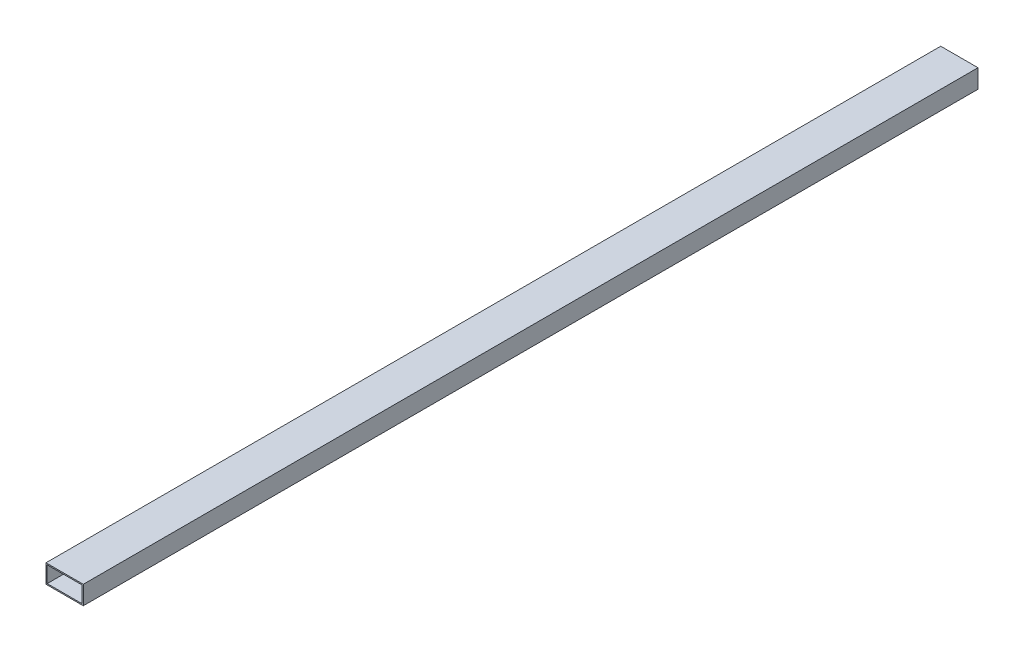
ISO-10303-21;
HEADER;
FILE_DESCRIPTION(('STEP AP214'),'2;1');
FILE_NAME('part.step','',(''),(''),'','','');
FILE_SCHEMA(('AUTOMOTIVE_DESIGN { 1 0 10303 214 1 1 1 1 }'));
ENDSEC;
DATA;
#1=APPLICATION_CONTEXT('core data for automotive mechanical design processes');
#2=APPLICATION_PROTOCOL_DEFINITION('international standard','automotive_design',2000,#1);
#3=PRODUCT_CONTEXT('',#1,'mechanical');
#4=PRODUCT('Part','Part','',(#3));
#5=PRODUCT_RELATED_PRODUCT_CATEGORY('part','',(#4));
#6=PRODUCT_DEFINITION_FORMATION('','',#4);
#7=PRODUCT_DEFINITION_CONTEXT('part definition',#1,'design');
#8=PRODUCT_DEFINITION('design','',#6,#7);
#9=PRODUCT_DEFINITION_SHAPE('','',#8);
#10=(LENGTH_UNIT() NAMED_UNIT(*) SI_UNIT(.MILLI.,.METRE.));
#11=(NAMED_UNIT(*) PLANE_ANGLE_UNIT() SI_UNIT($,.RADIAN.));
#12=(NAMED_UNIT(*) SI_UNIT($,.STERADIAN.) SOLID_ANGLE_UNIT());
#13=UNCERTAINTY_MEASURE_WITH_UNIT(LENGTH_MEASURE(1.E-05),#10,'distance_accuracy_value','');
#14=(GEOMETRIC_REPRESENTATION_CONTEXT(3) GLOBAL_UNCERTAINTY_ASSIGNED_CONTEXT((#13)) GLOBAL_UNIT_ASSIGNED_CONTEXT((#10,
#11,#12)) REPRESENTATION_CONTEXT('',''));
#15=CARTESIAN_POINT('',(0.,0.,0.));
#16=DIRECTION('',(0.,0.,1.));
#17=DIRECTION('',(1.,0.,0.));
#18=AXIS2_PLACEMENT_3D('',#15,#16,#17);
#19=CARTESIAN_POINT('',(0.,0.,1219.2));
#20=DIRECTION('',(0.,0.,-1.));
#21=DIRECTION('',(-1.,0.,0.));
#22=AXIS2_PLACEMENT_3D('',#19,#20,#21);
#23=PLANE('',#22);
#24=DIRECTION('',(0.,-1.,0.));
#25=VECTOR('',#24,1.);
#26=CARTESIAN_POINT('',(0.,0.,1219.2));
#27=LINE('',#26,#25);
#28=CARTESIAN_POINT('',(0.,25.4,1219.2));
#29=VERTEX_POINT('',#28);
#30=CARTESIAN_POINT('',(0.,0.,1219.2));
#31=VERTEX_POINT('',#30);
#32=EDGE_CURVE('E138',#29,#31,#27,.T.);
#33=ORIENTED_EDGE('',*,*,#32,.T.);
#34=DIRECTION('',(1.,0.,0.));
#35=VECTOR('',#34,1.);
#36=CARTESIAN_POINT('',(0.,0.,1219.2));
#37=LINE('',#36,#35);
#38=CARTESIAN_POINT('',(50.8,0.,1219.2));
#39=VERTEX_POINT('',#38);
#40=EDGE_CURVE('E141',#31,#39,#37,.T.);
#41=ORIENTED_EDGE('',*,*,#40,.T.);
#42=DIRECTION('',(0.,1.,0.));
#43=VECTOR('',#42,1.);
#44=CARTESIAN_POINT('',(50.8,0.,1219.2));
#45=LINE('',#44,#43);
#46=CARTESIAN_POINT('',(50.8,25.4,1219.2));
#47=VERTEX_POINT('',#46);
#48=EDGE_CURVE('E144',#39,#47,#45,.T.);
#49=ORIENTED_EDGE('',*,*,#48,.T.);
#50=DIRECTION('',(-1.,0.,0.));
#51=VECTOR('',#50,1.);
#52=CARTESIAN_POINT('',(0.,25.4,1219.2));
#53=LINE('',#52,#51);
#54=EDGE_CURVE('E146',#47,#29,#53,.T.);
#55=ORIENTED_EDGE('',*,*,#54,.T.);
#56=EDGE_LOOP('',(#33,#41,#49,#55));
#57=FACE_BOUND('',#56,.T.);
#58=DIRECTION('',(0.,-1.,0.));
#59=VECTOR('',#58,1.);
#60=CARTESIAN_POINT('',(1.651,1.651,1219.2));
#61=LINE('',#60,#59);
#62=CARTESIAN_POINT('',(1.651,23.749,1219.2));
#63=VERTEX_POINT('',#62);
#64=CARTESIAN_POINT('',(1.651,1.651,1219.2));
#65=VERTEX_POINT('',#64);
#66=EDGE_CURVE('E102',#63,#65,#61,.T.);
#67=ORIENTED_EDGE('',*,*,#66,.F.);
#68=DIRECTION('',(-1.,0.,0.));
#69=VECTOR('',#68,1.);
#70=CARTESIAN_POINT('',(1.651,23.749,1219.2));
#71=LINE('',#70,#69);
#72=CARTESIAN_POINT('',(49.149,23.749,1219.2));
#73=VERTEX_POINT('',#72);
#74=EDGE_CURVE('E124',#73,#63,#71,.T.);
#75=ORIENTED_EDGE('',*,*,#74,.F.);
#76=DIRECTION('',(0.,1.,0.));
#77=VECTOR('',#76,1.);
#78=CARTESIAN_POINT('',(49.149,1.651,1219.2));
#79=LINE('',#78,#77);
#80=CARTESIAN_POINT('',(49.149,1.651,1219.2));
#81=VERTEX_POINT('',#80);
#82=EDGE_CURVE('E122',#81,#73,#79,.T.);
#83=ORIENTED_EDGE('',*,*,#82,.F.);
#84=DIRECTION('',(1.,0.,0.));
#85=VECTOR('',#84,1.);
#86=CARTESIAN_POINT('',(1.651,1.651,1219.2));
#87=LINE('',#86,#85);
#88=EDGE_CURVE('E110',#65,#81,#87,.T.);
#89=ORIENTED_EDGE('',*,*,#88,.F.);
#90=EDGE_LOOP('',(#67,#75,#83,#89));
#91=FACE_BOUND('',#90,.T.);
#92=ADVANCED_FACE('F37',(#57,#91),#23,.F.);
#93=CARTESIAN_POINT('',(0.,0.,0.));
#94=DIRECTION('',(0.,0.,-1.));
#95=DIRECTION('',(-1.,0.,0.));
#96=AXIS2_PLACEMENT_3D('',#93,#94,#95);
#97=PLANE('',#96);
#98=DIRECTION('',(0.,-1.,0.));
#99=VECTOR('',#98,1.);
#100=CARTESIAN_POINT('',(0.,0.,0.));
#101=LINE('',#100,#99);
#102=CARTESIAN_POINT('',(0.,25.4,0.));
#103=VERTEX_POINT('',#102);
#104=CARTESIAN_POINT('',(0.,0.,0.));
#105=VERTEX_POINT('',#104);
#106=EDGE_CURVE('E118',#103,#105,#101,.T.);
#107=ORIENTED_EDGE('',*,*,#106,.F.);
#108=DIRECTION('',(-1.,0.,0.));
#109=VECTOR('',#108,1.);
#110=CARTESIAN_POINT('',(0.,25.4,0.));
#111=LINE('',#110,#109);
#112=CARTESIAN_POINT('',(50.8,25.4,0.));
#113=VERTEX_POINT('',#112);
#114=EDGE_CURVE('E142',#113,#103,#111,.T.);
#115=ORIENTED_EDGE('',*,*,#114,.F.);
#116=DIRECTION('',(0.,1.,0.));
#117=VECTOR('',#116,1.);
#118=CARTESIAN_POINT('',(50.8,0.,0.));
#119=LINE('',#118,#117);
#120=CARTESIAN_POINT('',(50.8,0.,0.));
#121=VERTEX_POINT('',#120);
#122=EDGE_CURVE('E153',#121,#113,#119,.T.);
#123=ORIENTED_EDGE('',*,*,#122,.F.);
#124=DIRECTION('',(1.,0.,0.));
#125=VECTOR('',#124,1.);
#126=CARTESIAN_POINT('',(0.,0.,0.));
#127=LINE('',#126,#125);
#128=EDGE_CURVE('E151',#105,#121,#127,.T.);
#129=ORIENTED_EDGE('',*,*,#128,.F.);
#130=EDGE_LOOP('',(#107,#115,#123,#129));
#131=FACE_BOUND('',#130,.T.);
#132=DIRECTION('',(-1.,0.,0.));
#133=VECTOR('',#132,1.);
#134=CARTESIAN_POINT('',(1.651,23.749,0.));
#135=LINE('',#134,#133);
#136=CARTESIAN_POINT('',(49.149,23.749,0.));
#137=VERTEX_POINT('',#136);
#138=CARTESIAN_POINT('',(1.651,23.749,0.));
#139=VERTEX_POINT('',#138);
#140=EDGE_CURVE('E111',#137,#139,#135,.T.);
#141=ORIENTED_EDGE('',*,*,#140,.T.);
#142=DIRECTION('',(0.,-1.,0.));
#143=VECTOR('',#142,1.);
#144=CARTESIAN_POINT('',(1.651,1.651,0.));
#145=LINE('',#144,#143);
#146=CARTESIAN_POINT('',(1.651,1.651,0.));
#147=VERTEX_POINT('',#146);
#148=EDGE_CURVE('E60',#139,#147,#145,.T.);
#149=ORIENTED_EDGE('',*,*,#148,.T.);
#150=DIRECTION('',(1.,0.,0.));
#151=VECTOR('',#150,1.);
#152=CARTESIAN_POINT('',(1.651,1.651,0.));
#153=LINE('',#152,#151);
#154=CARTESIAN_POINT('',(49.149,1.651,0.));
#155=VERTEX_POINT('',#154);
#156=EDGE_CURVE('E117',#147,#155,#153,.T.);
#157=ORIENTED_EDGE('',*,*,#156,.T.);
#158=DIRECTION('',(0.,1.,0.));
#159=VECTOR('',#158,1.);
#160=CARTESIAN_POINT('',(49.149,1.651,0.));
#161=LINE('',#160,#159);
#162=EDGE_CURVE('E130',#155,#137,#161,.T.);
#163=ORIENTED_EDGE('',*,*,#162,.T.);
#164=EDGE_LOOP('',(#141,#149,#157,#163));
#165=FACE_BOUND('',#164,.T.);
#166=ADVANCED_FACE('F171',(#131,#165),#97,.T.);
#167=CARTESIAN_POINT('',(0.,0.,1219.2));
#168=DIRECTION('',(1.,0.,0.));
#169=DIRECTION('',(0.,1.,0.));
#170=AXIS2_PLACEMENT_3D('',#167,#168,#169);
#171=PLANE('',#170);
#172=ORIENTED_EDGE('',*,*,#106,.T.);
#173=DIRECTION('',(0.,0.,-1.));
#174=VECTOR('',#173,1.);
#175=CARTESIAN_POINT('',(0.,0.,1219.2));
#176=LINE('',#175,#174);
#177=EDGE_CURVE('E11',#31,#105,#176,.T.);
#178=ORIENTED_EDGE('',*,*,#177,.F.);
#179=ORIENTED_EDGE('',*,*,#32,.F.);
#180=DIRECTION('',(0.,0.,-1.));
#181=VECTOR('',#180,1.);
#182=CARTESIAN_POINT('',(0.,25.4,1219.2));
#183=LINE('',#182,#181);
#184=EDGE_CURVE('E148',#29,#103,#183,.T.);
#185=ORIENTED_EDGE('',*,*,#184,.T.);
#186=EDGE_LOOP('',(#172,#178,#179,#185));
#187=FACE_BOUND('',#186,.T.);
#188=ADVANCED_FACE('F39',(#187),#171,.F.);
#189=CARTESIAN_POINT('',(0.,0.,1219.2));
#190=DIRECTION('',(0.,1.,0.));
#191=DIRECTION('',(0.,0.,1.));
#192=AXIS2_PLACEMENT_3D('',#189,#190,#191);
#193=PLANE('',#192);
#194=ORIENTED_EDGE('',*,*,#128,.T.);
#195=DIRECTION('',(0.,0.,-1.));
#196=VECTOR('',#195,1.);
#197=CARTESIAN_POINT('',(50.8,0.,1219.2));
#198=LINE('',#197,#196);
#199=EDGE_CURVE('E45',#39,#121,#198,.T.);
#200=ORIENTED_EDGE('',*,*,#199,.F.);
#201=ORIENTED_EDGE('',*,*,#40,.F.);
#202=ORIENTED_EDGE('',*,*,#177,.T.);
#203=EDGE_LOOP('',(#194,#200,#201,#202));
#204=FACE_BOUND('',#203,.T.);
#205=ADVANCED_FACE('F181',(#204),#193,.F.);
#206=CARTESIAN_POINT('',(50.8,0.,1219.2));
#207=DIRECTION('',(-1.,0.,0.));
#208=DIRECTION('',(0.,-1.,0.));
#209=AXIS2_PLACEMENT_3D('',#206,#207,#208);
#210=PLANE('',#209);
#211=ORIENTED_EDGE('',*,*,#122,.T.);
#212=DIRECTION('',(0.,0.,-1.));
#213=VECTOR('',#212,1.);
#214=CARTESIAN_POINT('',(50.8,25.4,1219.2));
#215=LINE('',#214,#213);
#216=EDGE_CURVE('E158',#47,#113,#215,.T.);
#217=ORIENTED_EDGE('',*,*,#216,.F.);
#218=ORIENTED_EDGE('',*,*,#48,.F.);
#219=ORIENTED_EDGE('',*,*,#199,.T.);
#220=EDGE_LOOP('',(#211,#217,#218,#219));
#221=FACE_BOUND('',#220,.T.);
#222=ADVANCED_FACE('F165',(#221),#210,.F.);
#223=CARTESIAN_POINT('',(0.,25.4,1219.2));
#224=DIRECTION('',(0.,-1.,0.));
#225=DIRECTION('',(0.,0.,-1.));
#226=AXIS2_PLACEMENT_3D('',#223,#224,#225);
#227=PLANE('',#226);
#228=ORIENTED_EDGE('',*,*,#114,.T.);
#229=ORIENTED_EDGE('',*,*,#184,.F.);
#230=ORIENTED_EDGE('',*,*,#54,.F.);
#231=ORIENTED_EDGE('',*,*,#216,.T.);
#232=EDGE_LOOP('',(#228,#229,#230,#231));
#233=FACE_BOUND('',#232,.T.);
#234=ADVANCED_FACE('F175',(#233),#227,.F.);
#235=CARTESIAN_POINT('',(1.651,1.651,1219.2));
#236=DIRECTION('',(1.,0.,0.));
#237=DIRECTION('',(0.,0.,-1.));
#238=AXIS2_PLACEMENT_3D('',#235,#236,#237);
#239=PLANE('',#238);
#240=ORIENTED_EDGE('',*,*,#148,.F.);
#241=DIRECTION('',(0.,0.,-1.));
#242=VECTOR('',#241,1.);
#243=CARTESIAN_POINT('',(1.651,23.749,1219.2));
#244=LINE('',#243,#242);
#245=EDGE_CURVE('E106',#63,#139,#244,.T.);
#246=ORIENTED_EDGE('',*,*,#245,.F.);
#247=ORIENTED_EDGE('',*,*,#66,.T.);
#248=DIRECTION('',(0.,0.,-1.));
#249=VECTOR('',#248,1.);
#250=CARTESIAN_POINT('',(1.651,1.651,1219.2));
#251=LINE('',#250,#249);
#252=EDGE_CURVE('E105',#65,#147,#251,.T.);
#253=ORIENTED_EDGE('',*,*,#252,.T.);
#254=EDGE_LOOP('',(#240,#246,#247,#253));
#255=FACE_BOUND('',#254,.T.);
#256=ADVANCED_FACE('F104',(#255),#239,.T.);
#257=CARTESIAN_POINT('',(1.651,1.651,1219.2));
#258=DIRECTION('',(0.,1.,0.));
#259=DIRECTION('',(0.,0.,1.));
#260=AXIS2_PLACEMENT_3D('',#257,#258,#259);
#261=PLANE('',#260);
#262=ORIENTED_EDGE('',*,*,#156,.F.);
#263=ORIENTED_EDGE('',*,*,#252,.F.);
#264=ORIENTED_EDGE('',*,*,#88,.T.);
#265=DIRECTION('',(0.,0.,-1.));
#266=VECTOR('',#265,1.);
#267=CARTESIAN_POINT('',(49.149,1.651,1219.2));
#268=LINE('',#267,#266);
#269=EDGE_CURVE('E119',#81,#155,#268,.T.);
#270=ORIENTED_EDGE('',*,*,#269,.T.);
#271=EDGE_LOOP('',(#262,#263,#264,#270));
#272=FACE_BOUND('',#271,.T.);
#273=ADVANCED_FACE('F114',(#272),#261,.T.);
#274=CARTESIAN_POINT('',(49.149,1.651,1219.2));
#275=DIRECTION('',(-1.,0.,0.));
#276=DIRECTION('',(0.,0.,1.));
#277=AXIS2_PLACEMENT_3D('',#274,#275,#276);
#278=PLANE('',#277);
#279=ORIENTED_EDGE('',*,*,#162,.F.);
#280=ORIENTED_EDGE('',*,*,#269,.F.);
#281=ORIENTED_EDGE('',*,*,#82,.T.);
#282=DIRECTION('',(0.,0.,-1.));
#283=VECTOR('',#282,1.);
#284=CARTESIAN_POINT('',(49.149,23.749,1219.2));
#285=LINE('',#284,#283);
#286=EDGE_CURVE('E52',#73,#137,#285,.T.);
#287=ORIENTED_EDGE('',*,*,#286,.T.);
#288=EDGE_LOOP('',(#279,#280,#281,#287));
#289=FACE_BOUND('',#288,.T.);
#290=ADVANCED_FACE('F204',(#289),#278,.T.);
#291=CARTESIAN_POINT('',(1.651,23.749,1219.2));
#292=DIRECTION('',(0.,-1.,0.));
#293=DIRECTION('',(0.,0.,-1.));
#294=AXIS2_PLACEMENT_3D('',#291,#292,#293);
#295=PLANE('',#294);
#296=ORIENTED_EDGE('',*,*,#140,.F.);
#297=ORIENTED_EDGE('',*,*,#286,.F.);
#298=ORIENTED_EDGE('',*,*,#74,.T.);
#299=ORIENTED_EDGE('',*,*,#245,.T.);
#300=EDGE_LOOP('',(#296,#297,#298,#299));
#301=FACE_BOUND('',#300,.T.);
#302=ADVANCED_FACE('F208',(#301),#295,.T.);
#303=CLOSED_SHELL('',(#92,#166,#188,#205,#222,#234,#256,#273,#290,#302));
#304=MANIFOLD_SOLID_BREP('B2',#303);
#305=ADVANCED_BREP_SHAPE_REPRESENTATION('',(#18,#304),#14);
#306=SHAPE_DEFINITION_REPRESENTATION(#9,#305);
ENDSEC;
END-ISO-10303-21;
